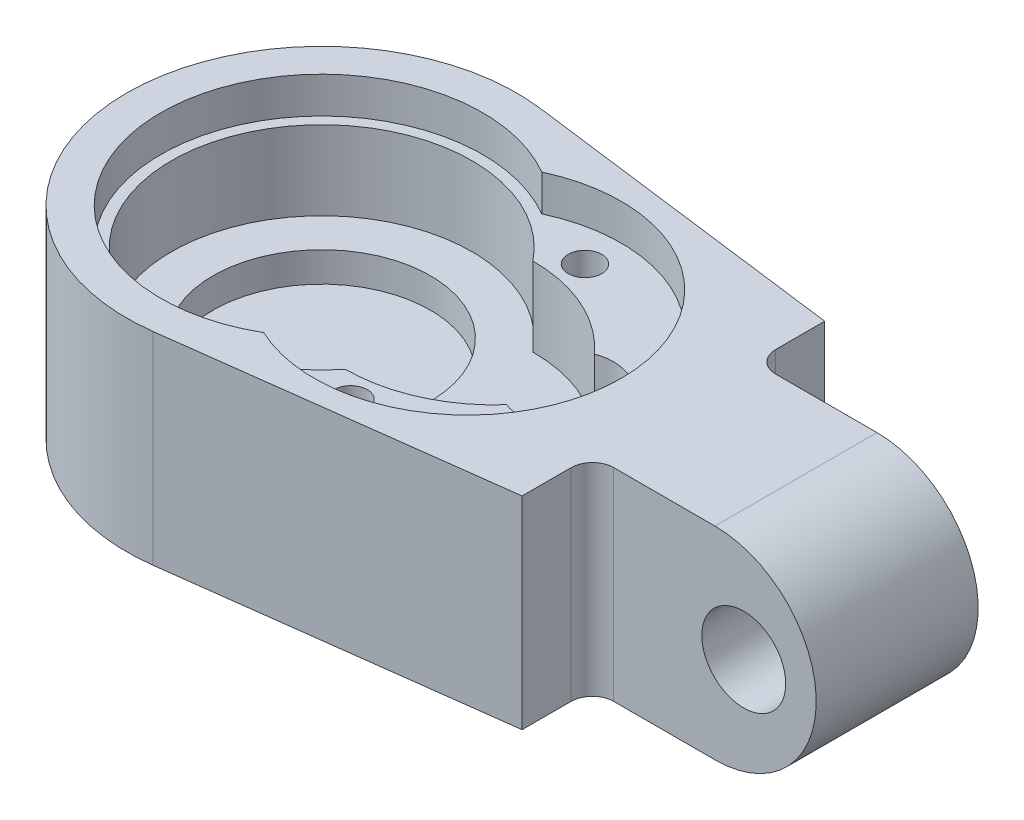
ISO-10303-21;
HEADER;
FILE_DESCRIPTION(('STEP AP214'),'2;1');
FILE_NAME('part.step','',(''),(''),'','','');
FILE_SCHEMA(('AUTOMOTIVE_DESIGN { 1 0 10303 214 1 1 1 1 }'));
ENDSEC;
DATA;
#1=APPLICATION_CONTEXT('core data for automotive mechanical design processes');
#2=APPLICATION_PROTOCOL_DEFINITION('international standard','automotive_design',2000,#1);
#3=PRODUCT_CONTEXT('',#1,'mechanical');
#4=PRODUCT('Part','Part','',(#3));
#5=PRODUCT_RELATED_PRODUCT_CATEGORY('part','',(#4));
#6=PRODUCT_DEFINITION_FORMATION('','',#4);
#7=PRODUCT_DEFINITION_CONTEXT('part definition',#1,'design');
#8=PRODUCT_DEFINITION('design','',#6,#7);
#9=PRODUCT_DEFINITION_SHAPE('','',#8);
#10=(LENGTH_UNIT() NAMED_UNIT(*) SI_UNIT(.MILLI.,.METRE.));
#11=(NAMED_UNIT(*) PLANE_ANGLE_UNIT() SI_UNIT($,.RADIAN.));
#12=(NAMED_UNIT(*) SI_UNIT($,.STERADIAN.) SOLID_ANGLE_UNIT());
#13=UNCERTAINTY_MEASURE_WITH_UNIT(LENGTH_MEASURE(1.E-05),#10,'distance_accuracy_value','');
#14=(GEOMETRIC_REPRESENTATION_CONTEXT(3) GLOBAL_UNCERTAINTY_ASSIGNED_CONTEXT((#13)) GLOBAL_UNIT_ASSIGNED_CONTEXT((#10,
#11,#12)) REPRESENTATION_CONTEXT('',''));
#15=CARTESIAN_POINT('',(0.,0.,0.));
#16=DIRECTION('',(0.,0.,1.));
#17=DIRECTION('',(1.,0.,0.));
#18=AXIS2_PLACEMENT_3D('',#15,#16,#17);
#19=CARTESIAN_POINT('',(34.29,12.065,4.826));
#20=DIRECTION('',(0.,0.,-1.));
#21=DIRECTION('',(-1.,0.,0.));
#22=AXIS2_PLACEMENT_3D('',#19,#20,#21);
#23=PLANE('',#22);
#24=CARTESIAN_POINT('',(29.972,6.0325,4.826));
#25=DIRECTION('',(0.,0.,1.));
#26=DIRECTION('',(1.,0.,0.));
#27=AXIS2_PLACEMENT_3D('',#24,#25,#26);
#28=CIRCLE('',#27,2.5);
#29=CARTESIAN_POINT('',(32.472,6.0325,4.826));
#30=VERTEX_POINT('',#29);
#31=EDGE_CURVE('E256',#30,#30,#28,.T.);
#32=ORIENTED_EDGE('',*,*,#31,.F.);
#33=EDGE_LOOP('',(#32));
#34=FACE_BOUND('',#33,.T.);
#35=DIRECTION('',(1.,0.,0.));
#36=VECTOR('',#35,1.);
#37=CARTESIAN_POINT('',(34.29,0.,4.826));
#38=LINE('',#37,#36);
#39=CARTESIAN_POINT('',(22.225,0.,4.826));
#40=VERTEX_POINT('',#39);
#41=CARTESIAN_POINT('',(28.2575,0.,4.826));
#42=VERTEX_POINT('',#41);
#43=EDGE_CURVE('E304',#40,#42,#38,.T.);
#44=ORIENTED_EDGE('',*,*,#43,.T.);
#45=CARTESIAN_POINT('',(28.2575,6.0325,4.826));
#46=DIRECTION('',(0.,0.,-1.));
#47=DIRECTION('',(-1.,0.,0.));
#48=AXIS2_PLACEMENT_3D('',#45,#46,#47);
#49=CIRCLE('',#48,6.03249999999999);
#50=CARTESIAN_POINT('',(28.2575,12.065,4.826));
#51=VERTEX_POINT('',#50);
#52=EDGE_CURVE('E267',#42,#51,#49,.F.);
#53=ORIENTED_EDGE('',*,*,#52,.T.);
#54=DIRECTION('',(1.,0.,0.));
#55=VECTOR('',#54,1.);
#56=CARTESIAN_POINT('',(34.29,12.065,4.826));
#57=LINE('',#56,#55);
#58=CARTESIAN_POINT('',(22.225,12.065,4.826));
#59=VERTEX_POINT('',#58);
#60=EDGE_CURVE('E287',#59,#51,#57,.T.);
#61=ORIENTED_EDGE('',*,*,#60,.F.);
#62=DIRECTION('',(0.,1.,0.));
#63=VECTOR('',#62,1.);
#64=CARTESIAN_POINT('',(22.225,12.065,4.826));
#65=LINE('',#64,#63);
#66=EDGE_CURVE('E324',#59,#40,#65,.F.);
#67=ORIENTED_EDGE('',*,*,#66,.T.);
#68=EDGE_LOOP('',(#44,#53,#61,#67));
#69=FACE_BOUND('',#68,.T.);
#70=ADVANCED_FACE('F71',(#34,#69),#23,.F.);
#71=CARTESIAN_POINT('',(34.29,12.065,-4.826));
#72=DIRECTION('',(0.,0.,1.));
#73=DIRECTION('',(1.,0.,0.));
#74=AXIS2_PLACEMENT_3D('',#71,#72,#73);
#75=PLANE('',#74);
#76=CARTESIAN_POINT('',(29.972,6.0325,-4.826));
#77=DIRECTION('',(0.,0.,1.));
#78=DIRECTION('',(1.,0.,0.));
#79=AXIS2_PLACEMENT_3D('',#76,#77,#78);
#80=CIRCLE('',#79,2.5);
#81=CARTESIAN_POINT('',(32.472,6.0325,-4.826));
#82=VERTEX_POINT('',#81);
#83=EDGE_CURVE('E261',#82,#82,#80,.T.);
#84=ORIENTED_EDGE('',*,*,#83,.T.);
#85=EDGE_LOOP('',(#84));
#86=FACE_BOUND('',#85,.T.);
#87=CARTESIAN_POINT('',(28.2575,6.0325,-4.826));
#88=DIRECTION('',(0.,0.,-1.));
#89=DIRECTION('',(-1.,0.,0.));
#90=AXIS2_PLACEMENT_3D('',#87,#88,#89);
#91=CIRCLE('',#90,6.03249999999999);
#92=CARTESIAN_POINT('',(28.2575,12.065,-4.826));
#93=VERTEX_POINT('',#92);
#94=CARTESIAN_POINT('',(28.2575,0.,-4.826));
#95=VERTEX_POINT('',#94);
#96=EDGE_CURVE('E270',#93,#95,#91,.T.);
#97=ORIENTED_EDGE('',*,*,#96,.T.);
#98=DIRECTION('',(-1.,0.,0.));
#99=VECTOR('',#98,1.);
#100=CARTESIAN_POINT('',(34.29,0.,-4.826));
#101=LINE('',#100,#99);
#102=CARTESIAN_POINT('',(22.225,0.,-4.826));
#103=VERTEX_POINT('',#102);
#104=EDGE_CURVE('E307',#95,#103,#101,.T.);
#105=ORIENTED_EDGE('',*,*,#104,.T.);
#106=DIRECTION('',(0.,-1.,0.));
#107=VECTOR('',#106,1.);
#108=CARTESIAN_POINT('',(22.225,12.065,-4.826));
#109=LINE('',#108,#107);
#110=CARTESIAN_POINT('',(22.225,12.065,-4.826));
#111=VERTEX_POINT('',#110);
#112=EDGE_CURVE('E334',#103,#111,#109,.F.);
#113=ORIENTED_EDGE('',*,*,#112,.T.);
#114=DIRECTION('',(-1.,0.,0.));
#115=VECTOR('',#114,1.);
#116=CARTESIAN_POINT('',(34.29,12.065,-4.826));
#117=LINE('',#116,#115);
#118=EDGE_CURVE('E290',#93,#111,#117,.T.);
#119=ORIENTED_EDGE('',*,*,#118,.F.);
#120=EDGE_LOOP('',(#97,#105,#113,#119));
#121=FACE_BOUND('',#120,.T.);
#122=ADVANCED_FACE('F363',(#86,#121),#75,.F.);
#123=CARTESIAN_POINT('',(0.,0.,0.));
#124=DIRECTION('',(0.,1.,0.));
#125=DIRECTION('',(0.,0.,1.));
#126=AXIS2_PLACEMENT_3D('',#123,#124,#125);
#127=PLANE('',#126);
#128=CARTESIAN_POINT('',(14.605,0.,0.));
#129=DIRECTION('',(0.,-1.,0.));
#130=DIRECTION('',(0.,0.,-1.));
#131=AXIS2_PLACEMENT_3D('',#128,#129,#130);
#132=CIRCLE('',#131,2.794);
#133=CARTESIAN_POINT('',(14.605,0.,-2.794));
#134=VERTEX_POINT('',#133);
#135=EDGE_CURVE('E213',#134,#134,#132,.T.);
#136=ORIENTED_EDGE('',*,*,#135,.F.);
#137=EDGE_LOOP('',(#136));
#138=FACE_BOUND('',#137,.T.);
#139=DIRECTION('',(0.,0.,-1.));
#140=VECTOR('',#139,1.);
#141=CARTESIAN_POINT('',(28.2575,0.,11.6215));
#142=LINE('',#141,#140);
#143=EDGE_CURVE('E264',#42,#95,#142,.T.);
#144=ORIENTED_EDGE('',*,*,#143,.F.);
#145=ORIENTED_EDGE('',*,*,#43,.F.);
#146=CARTESIAN_POINT('',(22.225,0.,6.096));
#147=DIRECTION('',(0.,1.,0.));
#148=DIRECTION('',(0.,0.,1.));
#149=AXIS2_PLACEMENT_3D('',#146,#147,#148);
#150=CIRCLE('',#149,1.27);
#151=CARTESIAN_POINT('',(20.955,0.,6.096));
#152=VERTEX_POINT('',#151);
#153=EDGE_CURVE('E327',#152,#40,#150,.F.);
#154=ORIENTED_EDGE('',*,*,#153,.F.);
#155=DIRECTION('',(0.,0.,-1.));
#156=VECTOR('',#155,1.);
#157=CARTESIAN_POINT('',(20.955,0.,4.826));
#158=LINE('',#157,#156);
#159=CARTESIAN_POINT('',(20.955,0.,9.017));
#160=VERTEX_POINT('',#159);
#161=EDGE_CURVE('E301',#160,#152,#158,.T.);
#162=ORIENTED_EDGE('',*,*,#161,.F.);
#163=DIRECTION('',(0.991803925393066,0.,-0.127769219982378));
#164=VECTOR('',#163,1.);
#165=CARTESIAN_POINT('',(1.48474222080522,0.,11.5252575150301));
#166=LINE('',#165,#164);
#167=CARTESIAN_POINT('',(1.48474222080522,0.,11.5252575150301));
#168=VERTEX_POINT('',#167);
#169=EDGE_CURVE('E299',#168,#160,#166,.T.);
#170=ORIENTED_EDGE('',*,*,#169,.F.);
#171=CARTESIAN_POINT('',(0.,0.,0.));
#172=DIRECTION('',(0.,1.,0.));
#173=DIRECTION('',(0.,0.,1.));
#174=AXIS2_PLACEMENT_3D('',#171,#172,#173);
#175=CIRCLE('',#174,11.6205);
#176=CARTESIAN_POINT('',(1.48474222080522,0.,-11.5252575150301));
#177=VERTEX_POINT('',#176);
#178=EDGE_CURVE('E297',#177,#168,#175,.T.);
#179=ORIENTED_EDGE('',*,*,#178,.F.);
#180=DIRECTION('',(-0.991803925393066,0.,-0.127769219982378));
#181=VECTOR('',#180,1.);
#182=CARTESIAN_POINT('',(1.48474222080522,0.,-11.5252575150301));
#183=LINE('',#182,#181);
#184=CARTESIAN_POINT('',(20.955,0.,-9.017));
#185=VERTEX_POINT('',#184);
#186=EDGE_CURVE('E275',#185,#177,#183,.T.);
#187=ORIENTED_EDGE('',*,*,#186,.F.);
#188=DIRECTION('',(0.,0.,-1.));
#189=VECTOR('',#188,1.);
#190=CARTESIAN_POINT('',(20.955,0.,-9.017));
#191=LINE('',#190,#189);
#192=CARTESIAN_POINT('',(20.955,0.,-6.096));
#193=VERTEX_POINT('',#192);
#194=EDGE_CURVE('E280',#193,#185,#191,.T.);
#195=ORIENTED_EDGE('',*,*,#194,.F.);
#196=CARTESIAN_POINT('',(22.225,0.,-6.096));
#197=DIRECTION('',(0.,1.,0.));
#198=DIRECTION('',(0.,0.,1.));
#199=AXIS2_PLACEMENT_3D('',#196,#197,#198);
#200=CIRCLE('',#199,1.27);
#201=EDGE_CURVE('E79',#103,#193,#200,.F.);
#202=ORIENTED_EDGE('',*,*,#201,.F.);
#203=ORIENTED_EDGE('',*,*,#104,.F.);
#204=EDGE_LOOP('',(#144,#145,#154,#162,#170,#179,#187,#195,#202,#203));
#205=FACE_BOUND('',#204,.T.);
#206=ADVANCED_FACE('F352',(#138,#205),#127,.F.);
#207=CARTESIAN_POINT('',(0.,12.065,0.));
#208=DIRECTION('',(0.,1.,0.));
#209=DIRECTION('',(0.,0.,1.));
#210=AXIS2_PLACEMENT_3D('',#207,#208,#209);
#211=PLANE('',#210);
#212=CARTESIAN_POINT('',(8.6995,12.065,0.));
#213=DIRECTION('',(0.,1.,0.));
#214=DIRECTION('',(0.,0.,1.));
#215=AXIS2_PLACEMENT_3D('',#212,#213,#214);
#216=CIRCLE('',#215,9.144);
#217=CARTESIAN_POINT('',(4.82831751824818,12.065,8.28412229466573));
#218=VERTEX_POINT('',#217);
#219=CARTESIAN_POINT('',(4.82831751824818,12.065,-8.28412229466573));
#220=VERTEX_POINT('',#219);
#221=EDGE_CURVE('E241',#218,#220,#216,.T.);
#222=ORIENTED_EDGE('',*,*,#221,.F.);
#223=CARTESIAN_POINT('',(0.,12.065,0.));
#224=DIRECTION('',(0.,1.,0.));
#225=DIRECTION('',(0.,0.,1.));
#226=AXIS2_PLACEMENT_3D('',#223,#224,#225);
#227=CIRCLE('',#226,9.5885);
#228=EDGE_CURVE('E247',#220,#218,#227,.T.);
#229=ORIENTED_EDGE('',*,*,#228,.F.);
#230=EDGE_LOOP('',(#222,#229));
#231=FACE_BOUND('',#230,.T.);
#232=ORIENTED_EDGE('',*,*,#60,.T.);
#233=DIRECTION('',(0.,0.,-1.));
#234=VECTOR('',#233,1.);
#235=CARTESIAN_POINT('',(28.2575,12.065,11.6215));
#236=LINE('',#235,#234);
#237=EDGE_CURVE('E272',#51,#93,#236,.T.);
#238=ORIENTED_EDGE('',*,*,#237,.T.);
#239=ORIENTED_EDGE('',*,*,#118,.T.);
#240=CARTESIAN_POINT('',(22.225,12.065,-6.096));
#241=DIRECTION('',(0.,1.,0.));
#242=DIRECTION('',(0.,0.,1.));
#243=AXIS2_PLACEMENT_3D('',#240,#241,#242);
#244=CIRCLE('',#243,1.27);
#245=CARTESIAN_POINT('',(20.955,12.065,-6.096));
#246=VERTEX_POINT('',#245);
#247=EDGE_CURVE('E337',#246,#111,#244,.T.);
#248=ORIENTED_EDGE('',*,*,#247,.F.);
#249=DIRECTION('',(0.,0.,-1.));
#250=VECTOR('',#249,1.);
#251=CARTESIAN_POINT('',(20.955,12.065,-9.017));
#252=LINE('',#251,#250);
#253=CARTESIAN_POINT('',(20.955,12.065,-9.017));
#254=VERTEX_POINT('',#253);
#255=EDGE_CURVE('E292',#246,#254,#252,.T.);
#256=ORIENTED_EDGE('',*,*,#255,.T.);
#257=DIRECTION('',(-0.991803925393066,0.,-0.127769219982378));
#258=VECTOR('',#257,1.);
#259=CARTESIAN_POINT('',(1.48474222080522,12.065,-11.5252575150301));
#260=LINE('',#259,#258);
#261=CARTESIAN_POINT('',(1.48474222080522,12.065,-11.5252575150301));
#262=VERTEX_POINT('',#261);
#263=EDGE_CURVE('E276',#254,#262,#260,.T.);
#264=ORIENTED_EDGE('',*,*,#263,.T.);
#265=CARTESIAN_POINT('',(0.,12.065,0.));
#266=DIRECTION('',(0.,1.,0.));
#267=DIRECTION('',(0.,0.,1.));
#268=AXIS2_PLACEMENT_3D('',#265,#266,#267);
#269=CIRCLE('',#268,11.6205);
#270=CARTESIAN_POINT('',(1.48474222080522,12.065,11.5252575150301));
#271=VERTEX_POINT('',#270);
#272=EDGE_CURVE('E279',#262,#271,#269,.T.);
#273=ORIENTED_EDGE('',*,*,#272,.T.);
#274=DIRECTION('',(0.991803925393066,0.,-0.127769219982378));
#275=VECTOR('',#274,1.);
#276=CARTESIAN_POINT('',(1.48474222080522,12.065,11.5252575150301));
#277=LINE('',#276,#275);
#278=CARTESIAN_POINT('',(20.955,12.065,9.017));
#279=VERTEX_POINT('',#278);
#280=EDGE_CURVE('E282',#271,#279,#277,.T.);
#281=ORIENTED_EDGE('',*,*,#280,.T.);
#282=DIRECTION('',(0.,0.,-1.));
#283=VECTOR('',#282,1.);
#284=CARTESIAN_POINT('',(20.955,12.065,4.826));
#285=LINE('',#284,#283);
#286=CARTESIAN_POINT('',(20.955,12.065,6.096));
#287=VERTEX_POINT('',#286);
#288=EDGE_CURVE('E284',#279,#287,#285,.T.);
#289=ORIENTED_EDGE('',*,*,#288,.T.);
#290=CARTESIAN_POINT('',(22.225,12.065,6.096));
#291=DIRECTION('',(0.,1.,0.));
#292=DIRECTION('',(0.,0.,1.));
#293=AXIS2_PLACEMENT_3D('',#290,#291,#292);
#294=CIRCLE('',#293,1.27);
#295=EDGE_CURVE('E329',#59,#287,#294,.T.);
#296=ORIENTED_EDGE('',*,*,#295,.F.);
#297=EDGE_LOOP('',(#232,#238,#239,#248,#256,#264,#273,#281,#289,#296));
#298=FACE_BOUND('',#297,.T.);
#299=ADVANCED_FACE('F359',(#231,#298),#211,.T.);
#300=CARTESIAN_POINT('',(22.225,12.065,-6.096));
#301=DIRECTION('',(0.,1.,0.));
#302=DIRECTION('',(0.,0.,1.));
#303=AXIS2_PLACEMENT_3D('',#300,#301,#302);
#304=CYLINDRICAL_SURFACE('',#303,1.27);
#305=DIRECTION('',(0.,-1.,0.));
#306=VECTOR('',#305,1.);
#307=CARTESIAN_POINT('',(20.955,12.065,-6.096));
#308=LINE('',#307,#306);
#309=EDGE_CURVE('E331',#246,#193,#308,.T.);
#310=ORIENTED_EDGE('',*,*,#309,.F.);
#311=ORIENTED_EDGE('',*,*,#247,.T.);
#312=ORIENTED_EDGE('',*,*,#112,.F.);
#313=ORIENTED_EDGE('',*,*,#201,.T.);
#314=EDGE_LOOP('',(#310,#311,#312,#313));
#315=FACE_BOUND('',#314,.T.);
#316=ADVANCED_FACE('F73',(#315),#304,.F.);
#317=CARTESIAN_POINT('',(22.225,12.065,6.096));
#318=DIRECTION('',(0.,-1.,0.));
#319=DIRECTION('',(0.,0.,-1.));
#320=AXIS2_PLACEMENT_3D('',#317,#318,#319);
#321=CYLINDRICAL_SURFACE('',#320,1.27);
#322=DIRECTION('',(0.,1.,0.));
#323=VECTOR('',#322,1.);
#324=CARTESIAN_POINT('',(20.955,12.065,6.096));
#325=LINE('',#324,#323);
#326=EDGE_CURVE('E321',#152,#287,#325,.T.);
#327=ORIENTED_EDGE('',*,*,#326,.F.);
#328=ORIENTED_EDGE('',*,*,#153,.T.);
#329=ORIENTED_EDGE('',*,*,#66,.F.);
#330=ORIENTED_EDGE('',*,*,#295,.T.);
#331=EDGE_LOOP('',(#327,#328,#329,#330));
#332=FACE_BOUND('',#331,.T.);
#333=ADVANCED_FACE('F371',(#332),#321,.F.);
#334=CARTESIAN_POINT('',(1.48474222080522,12.065,-11.5252575150301));
#335=DIRECTION('',(-0.127769219982378,0.,0.991803925393066));
#336=DIRECTION('',(0.991803925393066,0.,0.127769219982378));
#337=AXIS2_PLACEMENT_3D('',#334,#335,#336);
#338=PLANE('',#337);
#339=ORIENTED_EDGE('',*,*,#186,.T.);
#340=DIRECTION('',(0.,-1.,0.));
#341=VECTOR('',#340,1.);
#342=CARTESIAN_POINT('',(1.48474222080522,12.065,-11.5252575150301));
#343=LINE('',#342,#341);
#344=EDGE_CURVE('E318',#262,#177,#343,.T.);
#345=ORIENTED_EDGE('',*,*,#344,.F.);
#346=ORIENTED_EDGE('',*,*,#263,.F.);
#347=DIRECTION('',(0.,-1.,0.));
#348=VECTOR('',#347,1.);
#349=CARTESIAN_POINT('',(20.955,12.065,-9.017));
#350=LINE('',#349,#348);
#351=EDGE_CURVE('E294',#254,#185,#350,.T.);
#352=ORIENTED_EDGE('',*,*,#351,.T.);
#353=EDGE_LOOP('',(#339,#345,#346,#352));
#354=FACE_BOUND('',#353,.T.);
#355=ADVANCED_FACE('F356',(#354),#338,.F.);
#356=CARTESIAN_POINT('',(0.,12.065,0.));
#357=DIRECTION('',(0.,-1.,0.));
#358=DIRECTION('',(0.,0.,-1.));
#359=AXIS2_PLACEMENT_3D('',#356,#357,#358);
#360=CYLINDRICAL_SURFACE('',#359,11.6205);
#361=ORIENTED_EDGE('',*,*,#178,.T.);
#362=DIRECTION('',(0.,-1.,0.));
#363=VECTOR('',#362,1.);
#364=CARTESIAN_POINT('',(1.48474222080522,12.065,11.5252575150301));
#365=LINE('',#364,#363);
#366=EDGE_CURVE('E315',#271,#168,#365,.T.);
#367=ORIENTED_EDGE('',*,*,#366,.F.);
#368=ORIENTED_EDGE('',*,*,#272,.F.);
#369=ORIENTED_EDGE('',*,*,#344,.T.);
#370=EDGE_LOOP('',(#361,#367,#368,#369));
#371=FACE_BOUND('',#370,.T.);
#372=ADVANCED_FACE('F381',(#371),#360,.T.);
#373=CARTESIAN_POINT('',(1.48474222080522,12.065,11.5252575150301));
#374=DIRECTION('',(-0.127769219982378,0.,-0.991803925393066));
#375=DIRECTION('',(-0.991803925393066,0.,0.127769219982378));
#376=AXIS2_PLACEMENT_3D('',#373,#374,#375);
#377=PLANE('',#376);
#378=ORIENTED_EDGE('',*,*,#169,.T.);
#379=DIRECTION('',(0.,-1.,0.));
#380=VECTOR('',#379,1.);
#381=CARTESIAN_POINT('',(20.955,12.065,9.017));
#382=LINE('',#381,#380);
#383=EDGE_CURVE('E312',#279,#160,#382,.T.);
#384=ORIENTED_EDGE('',*,*,#383,.F.);
#385=ORIENTED_EDGE('',*,*,#280,.F.);
#386=ORIENTED_EDGE('',*,*,#366,.T.);
#387=EDGE_LOOP('',(#378,#384,#385,#386));
#388=FACE_BOUND('',#387,.T.);
#389=ADVANCED_FACE('F379',(#388),#377,.F.);
#390=CARTESIAN_POINT('',(20.955,12.065,4.826));
#391=DIRECTION('',(-1.,0.,0.));
#392=DIRECTION('',(0.,0.,1.));
#393=AXIS2_PLACEMENT_3D('',#390,#391,#392);
#394=PLANE('',#393);
#395=ORIENTED_EDGE('',*,*,#161,.T.);
#396=ORIENTED_EDGE('',*,*,#326,.T.);
#397=ORIENTED_EDGE('',*,*,#288,.F.);
#398=ORIENTED_EDGE('',*,*,#383,.T.);
#399=EDGE_LOOP('',(#395,#396,#397,#398));
#400=FACE_BOUND('',#399,.T.);
#401=ADVANCED_FACE('F374',(#400),#394,.F.);
#402=CARTESIAN_POINT('',(20.955,12.065,-9.017));
#403=DIRECTION('',(-1.,0.,0.));
#404=DIRECTION('',(0.,0.,1.));
#405=AXIS2_PLACEMENT_3D('',#402,#403,#404);
#406=PLANE('',#405);
#407=ORIENTED_EDGE('',*,*,#255,.F.);
#408=ORIENTED_EDGE('',*,*,#309,.T.);
#409=ORIENTED_EDGE('',*,*,#194,.T.);
#410=ORIENTED_EDGE('',*,*,#351,.F.);
#411=EDGE_LOOP('',(#407,#408,#409,#410));
#412=FACE_BOUND('',#411,.T.);
#413=ADVANCED_FACE('F348',(#412),#406,.F.);
#414=CARTESIAN_POINT('',(28.2575,6.0325,11.6215));
#415=DIRECTION('',(0.,0.,-1.));
#416=DIRECTION('',(-1.,0.,0.));
#417=AXIS2_PLACEMENT_3D('',#414,#415,#416);
#418=CYLINDRICAL_SURFACE('',#417,6.03249999999999);
#419=ORIENTED_EDGE('',*,*,#52,.F.);
#420=ORIENTED_EDGE('',*,*,#143,.T.);
#421=ORIENTED_EDGE('',*,*,#96,.F.);
#422=ORIENTED_EDGE('',*,*,#237,.F.);
#423=EDGE_LOOP('',(#419,#420,#421,#422));
#424=FACE_BOUND('',#423,.T.);
#425=ADVANCED_FACE('F405',(#424),#418,.T.);
#426=CARTESIAN_POINT('',(29.972,6.0325,4.826));
#427=DIRECTION('',(0.,0.,1.));
#428=DIRECTION('',(1.,0.,0.));
#429=AXIS2_PLACEMENT_3D('',#426,#427,#428);
#430=CYLINDRICAL_SURFACE('',#429,2.5);
#431=ORIENTED_EDGE('',*,*,#31,.T.);
#432=EDGE_LOOP('',(#431));
#433=FACE_BOUND('',#432,.T.);
#434=ORIENTED_EDGE('',*,*,#83,.F.);
#435=EDGE_LOOP('',(#434));
#436=FACE_BOUND('',#435,.T.);
#437=ADVANCED_FACE('F409',(#433,#436),#430,.F.);
#438=CARTESIAN_POINT('',(8.6995,9.906,0.));
#439=DIRECTION('',(0.,1.,0.));
#440=DIRECTION('',(0.,0.,1.));
#441=AXIS2_PLACEMENT_3D('',#438,#439,#440);
#442=CYLINDRICAL_SURFACE('',#441,9.144);
#443=ORIENTED_EDGE('',*,*,#221,.T.);
#444=DIRECTION('',(0.,1.,0.));
#445=VECTOR('',#444,1.);
#446=CARTESIAN_POINT('',(4.82831751824818,9.906,-8.28412229466573));
#447=LINE('',#446,#445);
#448=CARTESIAN_POINT('',(4.82831751824818,9.906,-8.28412229466573));
#449=VERTEX_POINT('',#448);
#450=EDGE_CURVE('E250',#449,#220,#447,.T.);
#451=ORIENTED_EDGE('',*,*,#450,.F.);
#452=CARTESIAN_POINT('',(8.6995,9.906,0.));
#453=DIRECTION('',(0.,1.,0.));
#454=DIRECTION('',(0.,0.,1.));
#455=AXIS2_PLACEMENT_3D('',#452,#453,#454);
#456=CIRCLE('',#455,9.144);
#457=CARTESIAN_POINT('',(4.82831751824818,9.906,8.28412229466573));
#458=VERTEX_POINT('',#457);
#459=EDGE_CURVE('E243',#458,#449,#456,.T.);
#460=ORIENTED_EDGE('',*,*,#459,.F.);
#461=DIRECTION('',(0.,1.,0.));
#462=VECTOR('',#461,1.);
#463=CARTESIAN_POINT('',(4.82831751824818,9.906,8.28412229466573));
#464=LINE('',#463,#462);
#465=EDGE_CURVE('E254',#458,#218,#464,.T.);
#466=ORIENTED_EDGE('',*,*,#465,.T.);
#467=EDGE_LOOP('',(#443,#451,#460,#466));
#468=FACE_BOUND('',#467,.T.);
#469=ADVANCED_FACE('F420',(#468),#442,.F.);
#470=CARTESIAN_POINT('',(0.,9.906,0.));
#471=DIRECTION('',(0.,1.,0.));
#472=DIRECTION('',(0.,0.,1.));
#473=AXIS2_PLACEMENT_3D('',#470,#471,#472);
#474=CYLINDRICAL_SURFACE('',#473,9.5885);
#475=ORIENTED_EDGE('',*,*,#228,.T.);
#476=ORIENTED_EDGE('',*,*,#465,.F.);
#477=CARTESIAN_POINT('',(0.,9.906,0.));
#478=DIRECTION('',(0.,1.,0.));
#479=DIRECTION('',(0.,0.,1.));
#480=AXIS2_PLACEMENT_3D('',#477,#478,#479);
#481=CIRCLE('',#480,9.5885);
#482=EDGE_CURVE('E246',#449,#458,#481,.T.);
#483=ORIENTED_EDGE('',*,*,#482,.F.);
#484=ORIENTED_EDGE('',*,*,#450,.T.);
#485=EDGE_LOOP('',(#475,#476,#483,#484));
#486=FACE_BOUND('',#485,.T.);
#487=ADVANCED_FACE('F424',(#486),#474,.F.);
#488=CARTESIAN_POINT('',(4.34975,9.906,0.));
#489=DIRECTION('',(0.,1.,0.));
#490=DIRECTION('',(0.,0.,1.));
#491=AXIS2_PLACEMENT_3D('',#488,#489,#490);
#492=PLANE('',#491);
#493=CARTESIAN_POINT('',(8.6995,9.906,-6.985));
#494=DIRECTION('',(0.,1.,0.));
#495=DIRECTION('',(0.,0.,1.));
#496=AXIS2_PLACEMENT_3D('',#493,#494,#495);
#497=CIRCLE('',#496,0.999999999999989);
#498=CARTESIAN_POINT('',(8.6995,9.906,-5.98500000000001));
#499=VERTEX_POINT('',#498);
#500=EDGE_CURVE('E199',#499,#499,#497,.T.);
#501=ORIENTED_EDGE('',*,*,#500,.F.);
#502=EDGE_LOOP('',(#501));
#503=FACE_BOUND('',#502,.T.);
#504=CARTESIAN_POINT('',(8.69950000000001,9.906,6.985));
#505=DIRECTION('',(0.,1.,0.));
#506=DIRECTION('',(0.,0.,1.));
#507=AXIS2_PLACEMENT_3D('',#504,#505,#506);
#508=CIRCLE('',#507,0.999999999999989);
#509=CARTESIAN_POINT('',(8.69950000000001,9.906,7.98499999999999));
#510=VERTEX_POINT('',#509);
#511=EDGE_CURVE('E198',#510,#510,#508,.T.);
#512=ORIENTED_EDGE('',*,*,#511,.F.);
#513=EDGE_LOOP('',(#512));
#514=FACE_BOUND('',#513,.T.);
#515=CARTESIAN_POINT('',(14.605,9.906,0.));
#516=DIRECTION('',(0.,1.,0.));
#517=DIRECTION('',(0.,0.,1.));
#518=AXIS2_PLACEMENT_3D('',#515,#516,#517);
#519=CIRCLE('',#518,2.794);
#520=CARTESIAN_POINT('',(13.6233312667338,9.906,2.61586744658967));
#521=VERTEX_POINT('',#520);
#522=CARTESIAN_POINT('',(13.6233312667338,9.906,-2.61586744658967));
#523=VERTEX_POINT('',#522);
#524=EDGE_CURVE('E222',#521,#523,#519,.T.);
#525=ORIENTED_EDGE('',*,*,#524,.F.);
#526=CARTESIAN_POINT('',(6.99567139379774,9.906,-3.2876888123698));
#527=DIRECTION('',(0.,1.,0.));
#528=DIRECTION('',(0.,0.,1.));
#529=AXIS2_PLACEMENT_3D('',#526,#527,#528);
#530=CIRCLE('',#529,8.8756888123698);
#531=CARTESIAN_POINT('',(6.99567139379774,9.906,5.588));
#532=VERTEX_POINT('',#531);
#533=EDGE_CURVE('E228',#532,#521,#530,.T.);
#534=ORIENTED_EDGE('',*,*,#533,.F.);
#535=CARTESIAN_POINT('',(0.,9.906,0.));
#536=DIRECTION('',(0.,1.,0.));
#537=DIRECTION('',(0.,0.,1.));
#538=AXIS2_PLACEMENT_3D('',#535,#536,#537);
#539=CIRCLE('',#538,8.9535);
#540=CARTESIAN_POINT('',(6.99567139379774,9.906,-5.588));
#541=VERTEX_POINT('',#540);
#542=EDGE_CURVE('E93',#541,#532,#539,.T.);
#543=ORIENTED_EDGE('',*,*,#542,.F.);
#544=CARTESIAN_POINT('',(6.99567139379774,9.906,3.2876888123698));
#545=DIRECTION('',(0.,1.,0.));
#546=DIRECTION('',(0.,0.,-1.));
#547=AXIS2_PLACEMENT_3D('',#544,#545,#546);
#548=CIRCLE('',#547,8.87568881236979);
#549=EDGE_CURVE('E224',#523,#541,#548,.T.);
#550=ORIENTED_EDGE('',*,*,#549,.F.);
#551=EDGE_LOOP('',(#525,#534,#543,#550));
#552=FACE_BOUND('',#551,.T.);
#553=ORIENTED_EDGE('',*,*,#459,.T.);
#554=ORIENTED_EDGE('',*,*,#482,.T.);
#555=EDGE_LOOP('',(#553,#554));
#556=FACE_BOUND('',#555,.T.);
#557=ADVANCED_FACE('F428',(#503,#514,#552,#556),#492,.T.);
#558=CARTESIAN_POINT('',(6.99567139379774,5.207,3.2876888123698));
#559=DIRECTION('',(0.,1.,0.));
#560=DIRECTION('',(0.,0.,1.));
#561=AXIS2_PLACEMENT_3D('',#558,#559,#560);
#562=CYLINDRICAL_SURFACE('',#561,8.87568881236979);
#563=CARTESIAN_POINT('',(6.99567139379774,5.207,3.2876888123698));
#564=DIRECTION('',(0.,1.,0.));
#565=DIRECTION('',(0.,0.,-1.));
#566=AXIS2_PLACEMENT_3D('',#563,#564,#565);
#567=CIRCLE('',#566,8.87568881236979);
#568=CARTESIAN_POINT('',(13.6233312667338,5.207,-2.61586744658966));
#569=VERTEX_POINT('',#568);
#570=CARTESIAN_POINT('',(6.99567139379774,5.207,-5.588));
#571=VERTEX_POINT('',#570);
#572=EDGE_CURVE('E225',#569,#571,#567,.T.);
#573=ORIENTED_EDGE('',*,*,#572,.F.);
#574=DIRECTION('',(0.,-1.,0.));
#575=VECTOR('',#574,1.);
#576=CARTESIAN_POINT('',(13.6233312667338,6.0325,-2.61586744658967));
#577=LINE('',#576,#575);
#578=EDGE_CURVE('E86',#569,#523,#577,.F.);
#579=ORIENTED_EDGE('',*,*,#578,.T.);
#580=ORIENTED_EDGE('',*,*,#549,.T.);
#581=DIRECTION('',(0.,1.,0.));
#582=VECTOR('',#581,1.);
#583=CARTESIAN_POINT('',(6.99567139379774,5.207,-5.588));
#584=LINE('',#583,#582);
#585=EDGE_CURVE('E234',#571,#541,#584,.T.);
#586=ORIENTED_EDGE('',*,*,#585,.F.);
#587=EDGE_LOOP('',(#573,#579,#580,#586));
#588=FACE_BOUND('',#587,.T.);
#589=ADVANCED_FACE('F432',(#588),#562,.F.);
#590=CARTESIAN_POINT('',(6.99567139379774,5.207,-3.2876888123698));
#591=DIRECTION('',(0.,1.,0.));
#592=DIRECTION('',(0.,0.,1.));
#593=AXIS2_PLACEMENT_3D('',#590,#591,#592);
#594=CYLINDRICAL_SURFACE('',#593,8.8756888123698);
#595=ORIENTED_EDGE('',*,*,#533,.T.);
#596=DIRECTION('',(0.,-1.,0.));
#597=VECTOR('',#596,1.);
#598=CARTESIAN_POINT('',(13.6233312667338,6.0325,2.61586744658967));
#599=LINE('',#598,#597);
#600=CARTESIAN_POINT('',(13.6233312667338,5.207,2.61586744658967));
#601=VERTEX_POINT('',#600);
#602=EDGE_CURVE('E218',#521,#601,#599,.T.);
#603=ORIENTED_EDGE('',*,*,#602,.T.);
#604=CARTESIAN_POINT('',(6.99567139379774,5.207,-3.2876888123698));
#605=DIRECTION('',(0.,1.,0.));
#606=DIRECTION('',(0.,0.,1.));
#607=AXIS2_PLACEMENT_3D('',#604,#605,#606);
#608=CIRCLE('',#607,8.8756888123698);
#609=CARTESIAN_POINT('',(6.99567139379774,5.207,5.588));
#610=VERTEX_POINT('',#609);
#611=EDGE_CURVE('E231',#610,#601,#608,.T.);
#612=ORIENTED_EDGE('',*,*,#611,.F.);
#613=DIRECTION('',(0.,1.,0.));
#614=VECTOR('',#613,1.);
#615=CARTESIAN_POINT('',(6.99567139379774,5.207,5.588));
#616=LINE('',#615,#614);
#617=EDGE_CURVE('E239',#610,#532,#616,.T.);
#618=ORIENTED_EDGE('',*,*,#617,.T.);
#619=EDGE_LOOP('',(#595,#603,#612,#618));
#620=FACE_BOUND('',#619,.T.);
#621=ADVANCED_FACE('F436',(#620),#594,.F.);
#622=CARTESIAN_POINT('',(0.,5.207,0.));
#623=DIRECTION('',(0.,1.,0.));
#624=DIRECTION('',(0.,0.,1.));
#625=AXIS2_PLACEMENT_3D('',#622,#623,#624);
#626=CYLINDRICAL_SURFACE('',#625,8.9535);
#627=ORIENTED_EDGE('',*,*,#542,.T.);
#628=ORIENTED_EDGE('',*,*,#617,.F.);
#629=CARTESIAN_POINT('',(0.,5.207,0.));
#630=DIRECTION('',(0.,1.,0.));
#631=DIRECTION('',(0.,0.,1.));
#632=AXIS2_PLACEMENT_3D('',#629,#630,#631);
#633=CIRCLE('',#632,8.9535);
#634=EDGE_CURVE('E227',#571,#610,#633,.T.);
#635=ORIENTED_EDGE('',*,*,#634,.F.);
#636=ORIENTED_EDGE('',*,*,#585,.T.);
#637=EDGE_LOOP('',(#627,#628,#635,#636));
#638=FACE_BOUND('',#637,.T.);
#639=ADVANCED_FACE('F438',(#638),#626,.F.);
#640=CARTESIAN_POINT('',(6.99567139379774,5.207,0.));
#641=DIRECTION('',(0.,-1.,0.));
#642=DIRECTION('',(0.,0.,-1.));
#643=AXIS2_PLACEMENT_3D('',#640,#641,#642);
#644=PLANE('',#643);
#645=CARTESIAN_POINT('',(0.,5.207,0.));
#646=DIRECTION('',(0.,1.,0.));
#647=DIRECTION('',(0.,0.,1.));
#648=AXIS2_PLACEMENT_3D('',#645,#646,#647);
#649=CIRCLE('',#648,6.477);
#650=CARTESIAN_POINT('',(0.,5.207,6.477));
#651=VERTEX_POINT('',#650);
#652=EDGE_CURVE('E209',#651,#651,#649,.T.);
#653=ORIENTED_EDGE('',*,*,#652,.F.);
#654=EDGE_LOOP('',(#653));
#655=FACE_BOUND('',#654,.T.);
#656=ORIENTED_EDGE('',*,*,#611,.T.);
#657=CARTESIAN_POINT('',(14.605,5.207,0.));
#658=DIRECTION('',(0.,-1.,0.));
#659=DIRECTION('',(0.,0.,-1.));
#660=AXIS2_PLACEMENT_3D('',#657,#658,#659);
#661=CIRCLE('',#660,2.794);
#662=EDGE_CURVE('E14',#601,#569,#661,.T.);
#663=ORIENTED_EDGE('',*,*,#662,.T.);
#664=ORIENTED_EDGE('',*,*,#572,.T.);
#665=ORIENTED_EDGE('',*,*,#634,.T.);
#666=EDGE_LOOP('',(#656,#663,#664,#665));
#667=FACE_BOUND('',#666,.T.);
#668=ADVANCED_FACE('F441',(#655,#667),#644,.F.);
#669=CARTESIAN_POINT('',(14.605,0.,0.));
#670=DIRECTION('',(0.,-1.,0.));
#671=DIRECTION('',(0.,0.,-1.));
#672=AXIS2_PLACEMENT_3D('',#669,#670,#671);
#673=CYLINDRICAL_SURFACE('',#672,2.794);
#674=ORIENTED_EDGE('',*,*,#524,.T.);
#675=ORIENTED_EDGE('',*,*,#578,.F.);
#676=ORIENTED_EDGE('',*,*,#662,.F.);
#677=ORIENTED_EDGE('',*,*,#602,.F.);
#678=EDGE_LOOP('',(#674,#675,#676,#677));
#679=FACE_BOUND('',#678,.T.);
#680=ORIENTED_EDGE('',*,*,#135,.T.);
#681=EDGE_LOOP('',(#680));
#682=FACE_BOUND('',#681,.T.);
#683=ADVANCED_FACE('F447',(#679,#682),#673,.F.);
#684=CARTESIAN_POINT('',(0.,3.429,0.));
#685=DIRECTION('',(0.,1.,0.));
#686=DIRECTION('',(0.,0.,1.));
#687=AXIS2_PLACEMENT_3D('',#684,#685,#686);
#688=CYLINDRICAL_SURFACE('',#687,6.477);
#689=CARTESIAN_POINT('',(0.,3.429,0.));
#690=DIRECTION('',(0.,1.,0.));
#691=DIRECTION('',(0.,0.,1.));
#692=AXIS2_PLACEMENT_3D('',#689,#690,#691);
#693=CIRCLE('',#692,6.477);
#694=CARTESIAN_POINT('',(0.,3.429,6.477));
#695=VERTEX_POINT('',#694);
#696=EDGE_CURVE('E210',#695,#695,#693,.T.);
#697=ORIENTED_EDGE('',*,*,#696,.F.);
#698=EDGE_LOOP('',(#697));
#699=FACE_BOUND('',#698,.T.);
#700=ORIENTED_EDGE('',*,*,#652,.T.);
#701=EDGE_LOOP('',(#700));
#702=FACE_BOUND('',#701,.T.);
#703=ADVANCED_FACE('F451',(#699,#702),#688,.F.);
#704=CARTESIAN_POINT('',(0.,3.429,0.));
#705=DIRECTION('',(0.,1.,0.));
#706=DIRECTION('',(0.,0.,1.));
#707=AXIS2_PLACEMENT_3D('',#704,#705,#706);
#708=PLANE('',#707);
#709=ORIENTED_EDGE('',*,*,#696,.T.);
#710=EDGE_LOOP('',(#709));
#711=FACE_BOUND('',#710,.T.);
#712=ADVANCED_FACE('F454',(#711),#708,.T.);
#713=CARTESIAN_POINT('',(8.69950000000001,5.6642,6.985));
#714=DIRECTION('',(0.,1.,0.));
#715=DIRECTION('',(0.,0.,1.));
#716=AXIS2_PLACEMENT_3D('',#713,#714,#715);
#717=CONICAL_SURFACE('',#716,0.999999999999999,1.02974425867665);
#718=CARTESIAN_POINT('',(8.69950000000001,5.06333938097244,6.985));
#719=VERTEX_POINT('',#718);
#720=VERTEX_LOOP('',#719);
#721=FACE_BOUND('',#720,.T.);
#722=CARTESIAN_POINT('',(8.69950000000001,5.6642,6.985));
#723=DIRECTION('',(0.,1.,0.));
#724=DIRECTION('',(0.,0.,1.));
#725=AXIS2_PLACEMENT_3D('',#722,#723,#724);
#726=CIRCLE('',#725,0.999999999999999);
#727=CARTESIAN_POINT('',(8.69950000000001,5.6642,7.985));
#728=VERTEX_POINT('',#727);
#729=EDGE_CURVE('E202',#728,#728,#726,.T.);
#730=ORIENTED_EDGE('',*,*,#729,.T.);
#731=EDGE_LOOP('',(#730));
#732=FACE_BOUND('',#731,.T.);
#733=ADVANCED_FACE('F458',(#721,#732),#717,.F.);
#734=CARTESIAN_POINT('',(8.69950000000001,9.906,6.985));
#735=DIRECTION('',(0.,1.,0.));
#736=DIRECTION('',(0.,0.,1.));
#737=AXIS2_PLACEMENT_3D('',#734,#735,#736);
#738=CYLINDRICAL_SURFACE('',#737,0.999999999999994);
#739=ORIENTED_EDGE('',*,*,#729,.F.);
#740=EDGE_LOOP('',(#739));
#741=FACE_BOUND('',#740,.T.);
#742=ORIENTED_EDGE('',*,*,#511,.T.);
#743=EDGE_LOOP('',(#742));
#744=FACE_BOUND('',#743,.T.);
#745=ADVANCED_FACE('F192',(#741,#744),#738,.F.);
#746=CARTESIAN_POINT('',(8.6995,5.6642,-6.985));
#747=DIRECTION('',(0.,1.,0.));
#748=DIRECTION('',(0.,0.,1.));
#749=AXIS2_PLACEMENT_3D('',#746,#747,#748);
#750=CONICAL_SURFACE('',#749,0.999999999999999,1.02974425867665);
#751=CARTESIAN_POINT('',(8.6995,5.06333938097244,-6.985));
#752=VERTEX_POINT('',#751);
#753=VERTEX_LOOP('',#752);
#754=FACE_BOUND('',#753,.T.);
#755=CARTESIAN_POINT('',(8.6995,5.6642,-6.985));
#756=DIRECTION('',(0.,1.,0.));
#757=DIRECTION('',(0.,0.,1.));
#758=AXIS2_PLACEMENT_3D('',#755,#756,#757);
#759=CIRCLE('',#758,0.999999999999999);
#760=CARTESIAN_POINT('',(8.6995,5.6642,-5.985));
#761=VERTEX_POINT('',#760);
#762=EDGE_CURVE('E196',#761,#761,#759,.T.);
#763=ORIENTED_EDGE('',*,*,#762,.T.);
#764=EDGE_LOOP('',(#763));
#765=FACE_BOUND('',#764,.T.);
#766=ADVANCED_FACE('F188',(#754,#765),#750,.F.);
#767=CARTESIAN_POINT('',(8.6995,9.906,-6.985));
#768=DIRECTION('',(0.,1.,0.));
#769=DIRECTION('',(0.,0.,1.));
#770=AXIS2_PLACEMENT_3D('',#767,#768,#769);
#771=CYLINDRICAL_SURFACE('',#770,0.999999999999994);
#772=ORIENTED_EDGE('',*,*,#762,.F.);
#773=EDGE_LOOP('',(#772));
#774=FACE_BOUND('',#773,.T.);
#775=ORIENTED_EDGE('',*,*,#500,.T.);
#776=EDGE_LOOP('',(#775));
#777=FACE_BOUND('',#776,.T.);
#778=ADVANCED_FACE('F191',(#774,#777),#771,.F.);
#779=CLOSED_SHELL('',(#70,#122,#206,#299,#316,#333,#355,#372,#389,#401,#413,#425,#437,#469,#487,
#557,#589,#621,#639,#668,#683,#703,#712,#733,#745,#766,#778));
#780=MANIFOLD_SOLID_BREP('B2',#779);
#781=ADVANCED_BREP_SHAPE_REPRESENTATION('',(#18,#780),#14);
#782=SHAPE_DEFINITION_REPRESENTATION(#9,#781);
ENDSEC;
END-ISO-10303-21;
